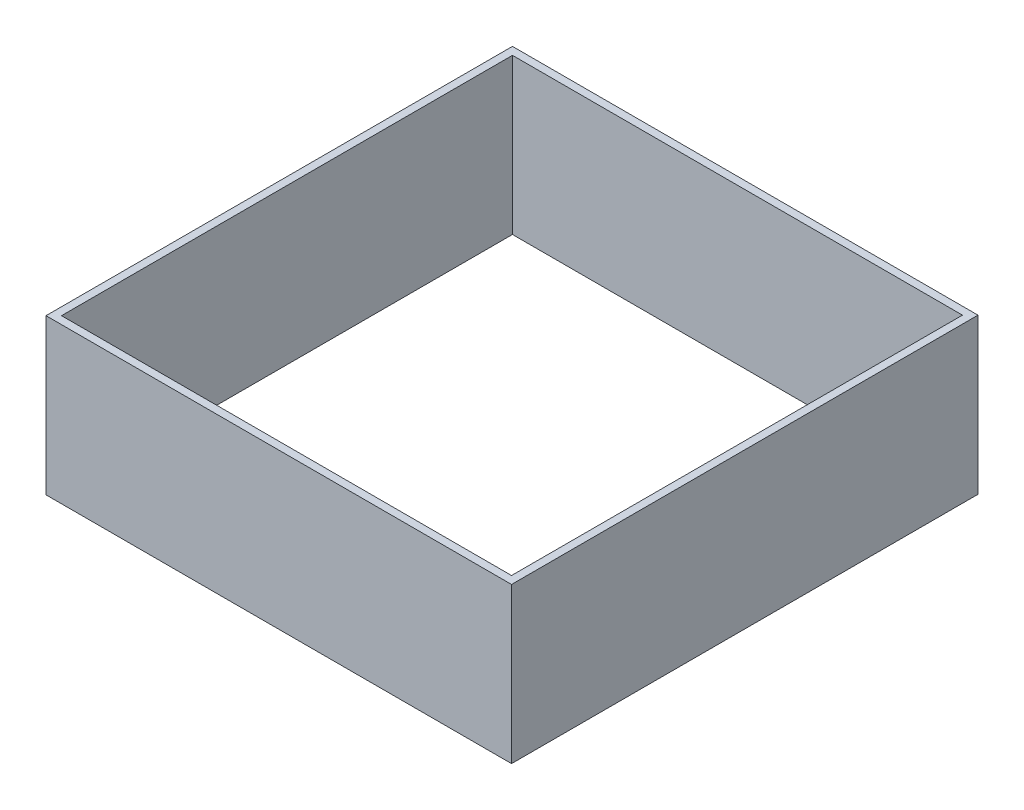
ISO-10303-21;
HEADER;
FILE_DESCRIPTION(('STEP AP214'),'2;1');
FILE_NAME('part.step','',(''),(''),'','','');
FILE_SCHEMA(('AUTOMOTIVE_DESIGN { 1 0 10303 214 1 1 1 1 }'));
ENDSEC;
DATA;
#1=APPLICATION_CONTEXT('core data for automotive mechanical design processes');
#2=APPLICATION_PROTOCOL_DEFINITION('international standard','automotive_design',2000,#1);
#3=PRODUCT_CONTEXT('',#1,'mechanical');
#4=PRODUCT('Part','Part','',(#3));
#5=PRODUCT_RELATED_PRODUCT_CATEGORY('part','',(#4));
#6=PRODUCT_DEFINITION_FORMATION('','',#4);
#7=PRODUCT_DEFINITION_CONTEXT('part definition',#1,'design');
#8=PRODUCT_DEFINITION('design','',#6,#7);
#9=PRODUCT_DEFINITION_SHAPE('','',#8);
#10=(LENGTH_UNIT() NAMED_UNIT(*) SI_UNIT(.MILLI.,.METRE.));
#11=(NAMED_UNIT(*) PLANE_ANGLE_UNIT() SI_UNIT($,.RADIAN.));
#12=(NAMED_UNIT(*) SI_UNIT($,.STERADIAN.) SOLID_ANGLE_UNIT());
#13=UNCERTAINTY_MEASURE_WITH_UNIT(LENGTH_MEASURE(1.E-05),#10,'distance_accuracy_value','');
#14=(GEOMETRIC_REPRESENTATION_CONTEXT(3) GLOBAL_UNCERTAINTY_ASSIGNED_CONTEXT((#13)) GLOBAL_UNIT_ASSIGNED_CONTEXT((#10,
#11,#12)) REPRESENTATION_CONTEXT('',''));
#15=CARTESIAN_POINT('',(0.,0.,0.));
#16=DIRECTION('',(0.,0.,1.));
#17=DIRECTION('',(1.,0.,0.));
#18=AXIS2_PLACEMENT_3D('',#15,#16,#17);
#19=CARTESIAN_POINT('',(145.,0.,0.));
#20=DIRECTION('',(1.,0.,0.));
#21=DIRECTION('',(0.,1.,0.));
#22=AXIS2_PLACEMENT_3D('',#19,#20,#21);
#23=PLANE('',#22);
#24=DIRECTION('',(0.,1.,0.));
#25=VECTOR('',#24,1.);
#26=CARTESIAN_POINT('',(145.,0.,-290.3));
#27=LINE('',#26,#25);
#28=CARTESIAN_POINT('',(145.,-50.,-290.3));
#29=VERTEX_POINT('',#28);
#30=CARTESIAN_POINT('',(145.,50.,-290.3));
#31=VERTEX_POINT('',#30);
#32=EDGE_CURVE('E56',#29,#31,#27,.T.);
#33=ORIENTED_EDGE('',*,*,#32,.F.);
#34=DIRECTION('',(0.,0.,-1.));
#35=VECTOR('',#34,1.);
#36=CARTESIAN_POINT('',(145.,-50.,5.3));
#37=LINE('',#36,#35);
#38=CARTESIAN_POINT('',(145.,-50.,0.3));
#39=VERTEX_POINT('',#38);
#40=EDGE_CURVE('E217',#39,#29,#37,.T.);
#41=ORIENTED_EDGE('',*,*,#40,.F.);
#42=DIRECTION('',(0.,1.,0.));
#43=VECTOR('',#42,1.);
#44=CARTESIAN_POINT('',(145.,0.,0.3));
#45=LINE('',#44,#43);
#46=CARTESIAN_POINT('',(145.,50.,0.3));
#47=VERTEX_POINT('',#46);
#48=EDGE_CURVE('E220',#39,#47,#45,.T.);
#49=ORIENTED_EDGE('',*,*,#48,.T.);
#50=DIRECTION('',(0.,0.,-1.));
#51=VECTOR('',#50,1.);
#52=CARTESIAN_POINT('',(145.,50.,5.3));
#53=LINE('',#52,#51);
#54=EDGE_CURVE('E52',#47,#31,#53,.T.);
#55=ORIENTED_EDGE('',*,*,#54,.T.);
#56=EDGE_LOOP('',(#33,#41,#49,#55));
#57=FACE_BOUND('',#56,.T.);
#58=ADVANCED_FACE('F37',(#57),#23,.F.);
#59=CARTESIAN_POINT('',(-145.,0.,0.));
#60=DIRECTION('',(-1.,0.,0.));
#61=DIRECTION('',(0.,1.,0.));
#62=AXIS2_PLACEMENT_3D('',#59,#60,#61);
#63=PLANE('',#62);
#64=DIRECTION('',(0.,-1.,0.));
#65=VECTOR('',#64,1.);
#66=CARTESIAN_POINT('',(-145.,0.,-290.3));
#67=LINE('',#66,#65);
#68=CARTESIAN_POINT('',(-145.,50.,-290.3));
#69=VERTEX_POINT('',#68);
#70=CARTESIAN_POINT('',(-145.,-50.,-290.3));
#71=VERTEX_POINT('',#70);
#72=EDGE_CURVE('E11',#69,#71,#67,.T.);
#73=ORIENTED_EDGE('',*,*,#72,.F.);
#74=DIRECTION('',(0.,0.,-1.));
#75=VECTOR('',#74,1.);
#76=CARTESIAN_POINT('',(-145.,50.,5.3));
#77=LINE('',#76,#75);
#78=CARTESIAN_POINT('',(-145.,50.,0.3));
#79=VERTEX_POINT('',#78);
#80=EDGE_CURVE('E209',#79,#69,#77,.T.);
#81=ORIENTED_EDGE('',*,*,#80,.F.);
#82=DIRECTION('',(0.,-1.,0.));
#83=VECTOR('',#82,1.);
#84=CARTESIAN_POINT('',(-145.,0.,0.3));
#85=LINE('',#84,#83);
#86=CARTESIAN_POINT('',(-145.,-50.,0.3));
#87=VERTEX_POINT('',#86);
#88=EDGE_CURVE('E215',#79,#87,#85,.T.);
#89=ORIENTED_EDGE('',*,*,#88,.T.);
#90=DIRECTION('',(0.,0.,-1.));
#91=VECTOR('',#90,1.);
#92=CARTESIAN_POINT('',(-145.,-50.,5.3));
#93=LINE('',#92,#91);
#94=EDGE_CURVE('E212',#87,#71,#93,.T.);
#95=ORIENTED_EDGE('',*,*,#94,.T.);
#96=EDGE_LOOP('',(#73,#81,#89,#95));
#97=FACE_BOUND('',#96,.T.);
#98=ADVANCED_FACE('F402',(#97),#63,.F.);
#99=CARTESIAN_POINT('',(0.,0.,0.3));
#100=DIRECTION('',(0.,0.,1.));
#101=DIRECTION('',(1.,0.,0.));
#102=AXIS2_PLACEMENT_3D('',#99,#100,#101);
#103=PLANE('',#102);
#104=DIRECTION('',(1.,0.,0.));
#105=VECTOR('',#104,1.);
#106=CARTESIAN_POINT('',(-20.,20.,0.3));
#107=LINE('',#106,#105);
#108=CARTESIAN_POINT('',(-20.,20.,0.3));
#109=VERTEX_POINT('',#108);
#110=CARTESIAN_POINT('',(20.,20.,0.3));
#111=VERTEX_POINT('',#110);
#112=EDGE_CURVE('E315',#109,#111,#107,.T.);
#113=ORIENTED_EDGE('',*,*,#112,.F.);
#114=DIRECTION('',(0.,-1.,0.));
#115=VECTOR('',#114,1.);
#116=CARTESIAN_POINT('',(-20.,20.,0.3));
#117=LINE('',#116,#115);
#118=CARTESIAN_POINT('',(-20.,-20.,0.3));
#119=VERTEX_POINT('',#118);
#120=EDGE_CURVE('E307',#109,#119,#117,.T.);
#121=ORIENTED_EDGE('',*,*,#120,.T.);
#122=DIRECTION('',(1.,0.,0.));
#123=VECTOR('',#122,1.);
#124=CARTESIAN_POINT('',(-20.,-20.,0.3));
#125=LINE('',#124,#123);
#126=CARTESIAN_POINT('',(20.,-20.,0.3));
#127=VERTEX_POINT('',#126);
#128=EDGE_CURVE('E309',#119,#127,#125,.T.);
#129=ORIENTED_EDGE('',*,*,#128,.T.);
#130=DIRECTION('',(0.,-1.,0.));
#131=VECTOR('',#130,1.);
#132=CARTESIAN_POINT('',(20.,20.,0.3));
#133=LINE('',#132,#131);
#134=EDGE_CURVE('E312',#111,#127,#133,.T.);
#135=ORIENTED_EDGE('',*,*,#134,.F.);
#136=EDGE_LOOP('',(#113,#121,#129,#135));
#137=FACE_BOUND('',#136,.T.);
#138=ORIENTED_EDGE('',*,*,#88,.F.);
#139=DIRECTION('',(-1.,0.,0.));
#140=VECTOR('',#139,1.);
#141=CARTESIAN_POINT('',(-150.,50.,0.3));
#142=LINE('',#141,#140);
#143=EDGE_CURVE('E222',#47,#79,#142,.T.);
#144=ORIENTED_EDGE('',*,*,#143,.F.);
#145=ORIENTED_EDGE('',*,*,#48,.F.);
#146=DIRECTION('',(1.,0.,0.));
#147=VECTOR('',#146,1.);
#148=CARTESIAN_POINT('',(-150.,-50.,0.3));
#149=LINE('',#148,#147);
#150=EDGE_CURVE('E225',#87,#39,#149,.T.);
#151=ORIENTED_EDGE('',*,*,#150,.F.);
#152=EDGE_LOOP('',(#138,#144,#145,#151));
#153=FACE_BOUND('',#152,.T.);
#154=ADVANCED_FACE('F394',(#137,#153),#103,.F.);
#155=CARTESIAN_POINT('',(0.,-10.,-10.));
#156=DIRECTION('',(0.,1.,0.));
#157=DIRECTION('',(0.,0.,1.));
#158=AXIS2_PLACEMENT_3D('',#155,#156,#157);
#159=CYLINDRICAL_SURFACE('',#158,5.);
#160=DIRECTION('',(0.,1.,0.));
#161=VECTOR('',#160,1.);
#162=CARTESIAN_POINT('',(-5.,-10.,-10.));
#163=LINE('',#162,#161);
#164=CARTESIAN_POINT('',(-5.,-10.,-10.));
#165=VERTEX_POINT('',#164);
#166=CARTESIAN_POINT('',(-5.,-2.5,-10.));
#167=VERTEX_POINT('',#166);
#168=EDGE_CURVE('E304',#165,#167,#163,.T.);
#169=ORIENTED_EDGE('',*,*,#168,.T.);
#170=CARTESIAN_POINT('',(0.,-2.5,-10.));
#171=DIRECTION('',(0.,1.,0.));
#172=DIRECTION('',(0.,0.,1.));
#173=AXIS2_PLACEMENT_3D('',#170,#171,#172);
#174=CIRCLE('',#173,5.);
#175=CARTESIAN_POINT('',(5.,-2.5,-10.));
#176=VERTEX_POINT('',#175);
#177=EDGE_CURVE('E248',#167,#176,#174,.F.);
#178=ORIENTED_EDGE('',*,*,#177,.T.);
#179=DIRECTION('',(0.,1.,0.));
#180=VECTOR('',#179,1.);
#181=CARTESIAN_POINT('',(5.,-10.,-10.));
#182=LINE('',#181,#180);
#183=CARTESIAN_POINT('',(5.,-10.,-10.));
#184=VERTEX_POINT('',#183);
#185=EDGE_CURVE('E293',#184,#176,#182,.T.);
#186=ORIENTED_EDGE('',*,*,#185,.F.);
#187=CARTESIAN_POINT('',(0.,-10.,-10.));
#188=DIRECTION('',(0.,1.,0.));
#189=DIRECTION('',(0.,0.,1.));
#190=AXIS2_PLACEMENT_3D('',#187,#188,#189);
#191=CIRCLE('',#190,5.);
#192=EDGE_CURVE('E280',#184,#165,#191,.T.);
#193=ORIENTED_EDGE('',*,*,#192,.T.);
#194=EDGE_LOOP('',(#169,#178,#186,#193));
#195=FACE_BOUND('',#194,.T.);
#196=ADVANCED_FACE('F375',(#195),#159,.T.);
#197=CARTESIAN_POINT('',(0.,-10.,-10.));
#198=DIRECTION('',(0.,1.,0.));
#199=DIRECTION('',(0.,0.,1.));
#200=AXIS2_PLACEMENT_3D('',#197,#198,#199);
#201=CYLINDRICAL_SURFACE('',#200,2.5);
#202=CARTESIAN_POINT('',(0.,-10.,-10.));
#203=DIRECTION('',(0.,1.,0.));
#204=DIRECTION('',(0.,0.,1.));
#205=AXIS2_PLACEMENT_3D('',#202,#203,#204);
#206=CIRCLE('',#205,2.5);
#207=CARTESIAN_POINT('',(0.,-10.,-7.5));
#208=VERTEX_POINT('',#207);
#209=EDGE_CURVE('E277',#208,#208,#206,.T.);
#210=ORIENTED_EDGE('',*,*,#209,.F.);
#211=EDGE_LOOP('',(#210));
#212=FACE_BOUND('',#211,.T.);
#213=CARTESIAN_POINT('',(0.,-2.5,-10.));
#214=DIRECTION('',(0.,1.,0.));
#215=DIRECTION('',(0.,0.,1.));
#216=AXIS2_PLACEMENT_3D('',#213,#214,#215);
#217=CIRCLE('',#216,2.5);
#218=CARTESIAN_POINT('',(0.,-2.5,-7.5));
#219=VERTEX_POINT('',#218);
#220=EDGE_CURVE('E244',#219,#219,#217,.F.);
#221=ORIENTED_EDGE('',*,*,#220,.F.);
#222=EDGE_LOOP('',(#221));
#223=FACE_BOUND('',#222,.T.);
#224=ADVANCED_FACE('F383',(#212,#223),#201,.F.);
#225=CARTESIAN_POINT('',(0.,0.,0.));
#226=DIRECTION('',(0.,0.,1.));
#227=DIRECTION('',(1.,0.,0.));
#228=AXIS2_PLACEMENT_3D('',#225,#226,#227);
#229=PLANE('',#228);
#230=DIRECTION('',(0.,-1.,0.));
#231=VECTOR('',#230,1.);
#232=CARTESIAN_POINT('',(-20.,20.,0.));
#233=LINE('',#232,#231);
#234=CARTESIAN_POINT('',(-20.,20.,0.));
#235=VERTEX_POINT('',#234);
#236=CARTESIAN_POINT('',(-20.,-20.,0.));
#237=VERTEX_POINT('',#236);
#238=EDGE_CURVE('E296',#235,#237,#233,.T.);
#239=ORIENTED_EDGE('',*,*,#238,.F.);
#240=DIRECTION('',(1.,0.,0.));
#241=VECTOR('',#240,1.);
#242=CARTESIAN_POINT('',(-20.,20.,0.));
#243=LINE('',#242,#241);
#244=CARTESIAN_POINT('',(20.,20.,0.));
#245=VERTEX_POINT('',#244);
#246=EDGE_CURVE('E310',#235,#245,#243,.T.);
#247=ORIENTED_EDGE('',*,*,#246,.T.);
#248=DIRECTION('',(0.,-1.,0.));
#249=VECTOR('',#248,1.);
#250=CARTESIAN_POINT('',(20.,20.,0.));
#251=LINE('',#250,#249);
#252=CARTESIAN_POINT('',(20.,-20.,0.));
#253=VERTEX_POINT('',#252);
#254=EDGE_CURVE('E324',#245,#253,#251,.T.);
#255=ORIENTED_EDGE('',*,*,#254,.T.);
#256=DIRECTION('',(1.,0.,0.));
#257=VECTOR('',#256,1.);
#258=CARTESIAN_POINT('',(-20.,-20.,0.));
#259=LINE('',#258,#257);
#260=EDGE_CURVE('E321',#237,#253,#259,.T.);
#261=ORIENTED_EDGE('',*,*,#260,.F.);
#262=EDGE_LOOP('',(#239,#247,#255,#261));
#263=FACE_BOUND('',#262,.T.);
#264=DIRECTION('',(1.,0.,0.));
#265=VECTOR('',#264,1.);
#266=CARTESIAN_POINT('',(-5.,-10.,0.));
#267=LINE('',#266,#265);
#268=CARTESIAN_POINT('',(-5.,-10.,0.));
#269=VERTEX_POINT('',#268);
#270=CARTESIAN_POINT('',(5.,-10.,0.));
#271=VERTEX_POINT('',#270);
#272=EDGE_CURVE('E286',#269,#271,#267,.T.);
#273=ORIENTED_EDGE('',*,*,#272,.T.);
#274=DIRECTION('',(0.,1.,0.));
#275=VECTOR('',#274,1.);
#276=CARTESIAN_POINT('',(5.,-10.,0.));
#277=LINE('',#276,#275);
#278=CARTESIAN_POINT('',(5.,10.,0.));
#279=VERTEX_POINT('',#278);
#280=EDGE_CURVE('E298',#271,#279,#277,.T.);
#281=ORIENTED_EDGE('',*,*,#280,.T.);
#282=DIRECTION('',(1.,0.,0.));
#283=VECTOR('',#282,1.);
#284=CARTESIAN_POINT('',(-5.,10.,0.));
#285=LINE('',#284,#283);
#286=CARTESIAN_POINT('',(-5.,10.,0.));
#287=VERTEX_POINT('',#286);
#288=EDGE_CURVE('E272',#287,#279,#285,.T.);
#289=ORIENTED_EDGE('',*,*,#288,.F.);
#290=DIRECTION('',(0.,1.,0.));
#291=VECTOR('',#290,1.);
#292=CARTESIAN_POINT('',(-5.,-10.,0.));
#293=LINE('',#292,#291);
#294=EDGE_CURVE('E301',#269,#287,#293,.T.);
#295=ORIENTED_EDGE('',*,*,#294,.F.);
#296=EDGE_LOOP('',(#273,#281,#289,#295));
#297=FACE_BOUND('',#296,.T.);
#298=ADVANCED_FACE('F368',(#263,#297),#229,.F.);
#299=CARTESIAN_POINT('',(-20.,20.,0.3));
#300=DIRECTION('',(1.,0.,0.));
#301=DIRECTION('',(0.,1.,0.));
#302=AXIS2_PLACEMENT_3D('',#299,#300,#301);
#303=PLANE('',#302);
#304=ORIENTED_EDGE('',*,*,#238,.T.);
#305=DIRECTION('',(0.,0.,-1.));
#306=VECTOR('',#305,1.);
#307=CARTESIAN_POINT('',(-20.,-20.,0.3));
#308=LINE('',#307,#306);
#309=EDGE_CURVE('E334',#119,#237,#308,.T.);
#310=ORIENTED_EDGE('',*,*,#309,.F.);
#311=ORIENTED_EDGE('',*,*,#120,.F.);
#312=DIRECTION('',(0.,0.,-1.));
#313=VECTOR('',#312,1.);
#314=CARTESIAN_POINT('',(-20.,20.,0.3));
#315=LINE('',#314,#313);
#316=EDGE_CURVE('E318',#109,#235,#315,.T.);
#317=ORIENTED_EDGE('',*,*,#316,.T.);
#318=EDGE_LOOP('',(#304,#310,#311,#317));
#319=FACE_BOUND('',#318,.T.);
#320=ADVANCED_FACE('F39',(#319),#303,.F.);
#321=CARTESIAN_POINT('',(-20.,-20.,0.3));
#322=DIRECTION('',(0.,1.,0.));
#323=DIRECTION('',(0.,0.,1.));
#324=AXIS2_PLACEMENT_3D('',#321,#322,#323);
#325=PLANE('',#324);
#326=ORIENTED_EDGE('',*,*,#260,.T.);
#327=DIRECTION('',(0.,0.,-1.));
#328=VECTOR('',#327,1.);
#329=CARTESIAN_POINT('',(20.,-20.,0.3));
#330=LINE('',#329,#328);
#331=EDGE_CURVE('E332',#127,#253,#330,.T.);
#332=ORIENTED_EDGE('',*,*,#331,.F.);
#333=ORIENTED_EDGE('',*,*,#128,.F.);
#334=ORIENTED_EDGE('',*,*,#309,.T.);
#335=EDGE_LOOP('',(#326,#332,#333,#334));
#336=FACE_BOUND('',#335,.T.);
#337=ADVANCED_FACE('F464',(#336),#325,.F.);
#338=CARTESIAN_POINT('',(20.,20.,0.3));
#339=DIRECTION('',(1.,0.,0.));
#340=DIRECTION('',(0.,1.,0.));
#341=AXIS2_PLACEMENT_3D('',#338,#339,#340);
#342=PLANE('',#341);
#343=ORIENTED_EDGE('',*,*,#254,.F.);
#344=DIRECTION('',(0.,0.,-1.));
#345=VECTOR('',#344,1.);
#346=CARTESIAN_POINT('',(20.,20.,0.3));
#347=LINE('',#346,#345);
#348=EDGE_CURVE('E330',#111,#245,#347,.T.);
#349=ORIENTED_EDGE('',*,*,#348,.F.);
#350=ORIENTED_EDGE('',*,*,#134,.T.);
#351=ORIENTED_EDGE('',*,*,#331,.T.);
#352=EDGE_LOOP('',(#343,#349,#350,#351));
#353=FACE_BOUND('',#352,.T.);
#354=ADVANCED_FACE('F471',(#353),#342,.T.);
#355=CARTESIAN_POINT('',(-20.,20.,0.3));
#356=DIRECTION('',(0.,1.,0.));
#357=DIRECTION('',(0.,0.,1.));
#358=AXIS2_PLACEMENT_3D('',#355,#356,#357);
#359=PLANE('',#358);
#360=ORIENTED_EDGE('',*,*,#246,.F.);
#361=ORIENTED_EDGE('',*,*,#316,.F.);
#362=ORIENTED_EDGE('',*,*,#112,.T.);
#363=ORIENTED_EDGE('',*,*,#348,.T.);
#364=EDGE_LOOP('',(#360,#361,#362,#363));
#365=FACE_BOUND('',#364,.T.);
#366=ADVANCED_FACE('F478',(#365),#359,.T.);
#367=CARTESIAN_POINT('',(0.,2.5,-10.));
#368=DIRECTION('',(0.,1.,0.));
#369=DIRECTION('',(0.,0.,1.));
#370=AXIS2_PLACEMENT_3D('',#367,#368,#369);
#371=CIRCLE('',#370,5.);
#372=CARTESIAN_POINT('',(-5.,2.5,-10.));
#373=VERTEX_POINT('',#372);
#374=CARTESIAN_POINT('',(5.,2.5,-10.));
#375=VERTEX_POINT('',#374);
#376=EDGE_CURVE('E257',#373,#375,#371,.F.);
#377=ORIENTED_EDGE('',*,*,#376,.F.);
#378=CARTESIAN_POINT('',(-5.,10.,-10.));
#379=VERTEX_POINT('',#378);
#380=EDGE_CURVE('E292',#373,#379,#163,.T.);
#381=ORIENTED_EDGE('',*,*,#380,.T.);
#382=CARTESIAN_POINT('',(0.,10.,-10.));
#383=DIRECTION('',(0.,1.,0.));
#384=DIRECTION('',(0.,0.,1.));
#385=AXIS2_PLACEMENT_3D('',#382,#383,#384);
#386=CIRCLE('',#385,5.);
#387=CARTESIAN_POINT('',(5.,10.,-10.));
#388=VERTEX_POINT('',#387);
#389=EDGE_CURVE('E267',#388,#379,#386,.T.);
#390=ORIENTED_EDGE('',*,*,#389,.F.);
#391=EDGE_CURVE('E297',#375,#388,#182,.T.);
#392=ORIENTED_EDGE('',*,*,#391,.F.);
#393=EDGE_LOOP('',(#377,#381,#390,#392));
#394=FACE_BOUND('',#393,.T.);
#395=ADVANCED_FACE('F360',(#394),#159,.T.);
#396=CARTESIAN_POINT('',(5.,-10.,-10.));
#397=DIRECTION('',(1.,0.,0.));
#398=DIRECTION('',(0.,0.,-1.));
#399=AXIS2_PLACEMENT_3D('',#396,#397,#398);
#400=PLANE('',#399);
#401=DIRECTION('',(0.,0.,1.));
#402=VECTOR('',#401,1.);
#403=CARTESIAN_POINT('',(5.,2.5,-10.));
#404=LINE('',#403,#402);
#405=CARTESIAN_POINT('',(5.,2.5,-4.));
#406=VERTEX_POINT('',#405);
#407=EDGE_CURVE('E259',#375,#406,#404,.T.);
#408=ORIENTED_EDGE('',*,*,#407,.F.);
#409=ORIENTED_EDGE('',*,*,#391,.T.);
#410=DIRECTION('',(0.,0.,-1.));
#411=VECTOR('',#410,1.);
#412=CARTESIAN_POINT('',(5.,10.,-10.));
#413=LINE('',#412,#411);
#414=EDGE_CURVE('E274',#279,#388,#413,.T.);
#415=ORIENTED_EDGE('',*,*,#414,.F.);
#416=ORIENTED_EDGE('',*,*,#280,.F.);
#417=DIRECTION('',(0.,0.,-1.));
#418=VECTOR('',#417,1.);
#419=CARTESIAN_POINT('',(5.,-10.,-10.));
#420=LINE('',#419,#418);
#421=EDGE_CURVE('E289',#271,#184,#420,.T.);
#422=ORIENTED_EDGE('',*,*,#421,.T.);
#423=ORIENTED_EDGE('',*,*,#185,.T.);
#424=DIRECTION('',(0.,0.,1.));
#425=VECTOR('',#424,1.);
#426=CARTESIAN_POINT('',(5.,-2.5,-10.));
#427=LINE('',#426,#425);
#428=CARTESIAN_POINT('',(5.,-2.5,-4.));
#429=VERTEX_POINT('',#428);
#430=EDGE_CURVE('E251',#176,#429,#427,.T.);
#431=ORIENTED_EDGE('',*,*,#430,.T.);
#432=DIRECTION('',(0.,1.,0.));
#433=VECTOR('',#432,1.);
#434=CARTESIAN_POINT('',(5.,-10.,-4.));
#435=LINE('',#434,#433);
#436=EDGE_CURVE('E261',#429,#406,#435,.T.);
#437=ORIENTED_EDGE('',*,*,#436,.T.);
#438=EDGE_LOOP('',(#408,#409,#415,#416,#422,#423,#431,#437));
#439=FACE_BOUND('',#438,.T.);
#440=ADVANCED_FACE('F356',(#439),#400,.T.);
#441=CARTESIAN_POINT('',(-5.,-10.,-10.));
#442=DIRECTION('',(-1.,0.,0.));
#443=DIRECTION('',(0.,0.,1.));
#444=AXIS2_PLACEMENT_3D('',#441,#442,#443);
#445=PLANE('',#444);
#446=DIRECTION('',(0.,0.,-1.));
#447=VECTOR('',#446,1.);
#448=CARTESIAN_POINT('',(-5.,2.5,-10.));
#449=LINE('',#448,#447);
#450=CARTESIAN_POINT('',(-5.,2.5,-4.));
#451=VERTEX_POINT('',#450);
#452=EDGE_CURVE('E255',#451,#373,#449,.T.);
#453=ORIENTED_EDGE('',*,*,#452,.F.);
#454=DIRECTION('',(0.,-1.,0.));
#455=VECTOR('',#454,1.);
#456=CARTESIAN_POINT('',(-5.,-10.,-4.));
#457=LINE('',#456,#455);
#458=CARTESIAN_POINT('',(-5.,-2.5,-4.));
#459=VERTEX_POINT('',#458);
#460=EDGE_CURVE('E45',#451,#459,#457,.T.);
#461=ORIENTED_EDGE('',*,*,#460,.T.);
#462=DIRECTION('',(0.,0.,-1.));
#463=VECTOR('',#462,1.);
#464=CARTESIAN_POINT('',(-5.,-2.5,-10.));
#465=LINE('',#464,#463);
#466=EDGE_CURVE('E245',#459,#167,#465,.T.);
#467=ORIENTED_EDGE('',*,*,#466,.T.);
#468=ORIENTED_EDGE('',*,*,#168,.F.);
#469=DIRECTION('',(0.,0.,1.));
#470=VECTOR('',#469,1.);
#471=CARTESIAN_POINT('',(-5.,-10.,-10.));
#472=LINE('',#471,#470);
#473=EDGE_CURVE('E283',#165,#269,#472,.T.);
#474=ORIENTED_EDGE('',*,*,#473,.T.);
#475=ORIENTED_EDGE('',*,*,#294,.T.);
#476=DIRECTION('',(0.,0.,1.));
#477=VECTOR('',#476,1.);
#478=CARTESIAN_POINT('',(-5.,10.,-10.));
#479=LINE('',#478,#477);
#480=EDGE_CURVE('E270',#379,#287,#479,.T.);
#481=ORIENTED_EDGE('',*,*,#480,.F.);
#482=ORIENTED_EDGE('',*,*,#380,.F.);
#483=EDGE_LOOP('',(#453,#461,#467,#468,#474,#475,#481,#482));
#484=FACE_BOUND('',#483,.T.);
#485=ADVANCED_FACE('F343',(#484),#445,.T.);
#486=CARTESIAN_POINT('',(0.,-10.,-10.));
#487=DIRECTION('',(0.,1.,0.));
#488=DIRECTION('',(0.,0.,1.));
#489=AXIS2_PLACEMENT_3D('',#486,#487,#488);
#490=PLANE('',#489);
#491=ORIENTED_EDGE('',*,*,#209,.T.);
#492=EDGE_LOOP('',(#491));
#493=FACE_BOUND('',#492,.T.);
#494=ORIENTED_EDGE('',*,*,#192,.F.);
#495=ORIENTED_EDGE('',*,*,#421,.F.);
#496=ORIENTED_EDGE('',*,*,#272,.F.);
#497=ORIENTED_EDGE('',*,*,#473,.F.);
#498=EDGE_LOOP('',(#494,#495,#496,#497));
#499=FACE_BOUND('',#498,.T.);
#500=ADVANCED_FACE('F373',(#493,#499),#490,.F.);
#501=CARTESIAN_POINT('',(0.,2.5,-10.));
#502=DIRECTION('',(0.,1.,0.));
#503=DIRECTION('',(0.,0.,1.));
#504=AXIS2_PLACEMENT_3D('',#501,#502,#503);
#505=CIRCLE('',#504,2.5);
#506=CARTESIAN_POINT('',(0.,2.5,-7.5));
#507=VERTEX_POINT('',#506);
#508=EDGE_CURVE('E254',#507,#507,#505,.F.);
#509=ORIENTED_EDGE('',*,*,#508,.T.);
#510=EDGE_LOOP('',(#509));
#511=FACE_BOUND('',#510,.T.);
#512=CARTESIAN_POINT('',(0.,10.,-10.));
#513=DIRECTION('',(0.,1.,0.));
#514=DIRECTION('',(0.,0.,1.));
#515=AXIS2_PLACEMENT_3D('',#512,#513,#514);
#516=CIRCLE('',#515,2.5);
#517=CARTESIAN_POINT('',(0.,10.,-7.5));
#518=VERTEX_POINT('',#517);
#519=EDGE_CURVE('E264',#518,#518,#516,.T.);
#520=ORIENTED_EDGE('',*,*,#519,.T.);
#521=EDGE_LOOP('',(#520));
#522=FACE_BOUND('',#521,.T.);
#523=ADVANCED_FACE('F387',(#511,#522),#201,.F.);
#524=CARTESIAN_POINT('',(0.,10.,-10.));
#525=DIRECTION('',(0.,1.,0.));
#526=DIRECTION('',(0.,0.,1.));
#527=AXIS2_PLACEMENT_3D('',#524,#525,#526);
#528=PLANE('',#527);
#529=ORIENTED_EDGE('',*,*,#389,.T.);
#530=ORIENTED_EDGE('',*,*,#480,.T.);
#531=ORIENTED_EDGE('',*,*,#288,.T.);
#532=ORIENTED_EDGE('',*,*,#414,.T.);
#533=EDGE_LOOP('',(#529,#530,#531,#532));
#534=FACE_BOUND('',#533,.T.);
#535=ORIENTED_EDGE('',*,*,#519,.F.);
#536=EDGE_LOOP('',(#535));
#537=FACE_BOUND('',#536,.T.);
#538=ADVANCED_FACE('F363',(#534,#537),#528,.T.);
#539=CARTESIAN_POINT('',(0.,2.5,0.));
#540=DIRECTION('',(0.,1.,0.));
#541=DIRECTION('',(0.,0.,1.));
#542=AXIS2_PLACEMENT_3D('',#539,#540,#541);
#543=PLANE('',#542);
#544=ORIENTED_EDGE('',*,*,#407,.T.);
#545=DIRECTION('',(1.,0.,0.));
#546=VECTOR('',#545,1.);
#547=CARTESIAN_POINT('',(-7.02807757222276,2.5,-4.));
#548=LINE('',#547,#546);
#549=EDGE_CURVE('E241',#451,#406,#548,.T.);
#550=ORIENTED_EDGE('',*,*,#549,.F.);
#551=ORIENTED_EDGE('',*,*,#452,.T.);
#552=ORIENTED_EDGE('',*,*,#376,.T.);
#553=EDGE_LOOP('',(#544,#550,#551,#552));
#554=FACE_BOUND('',#553,.T.);
#555=ORIENTED_EDGE('',*,*,#508,.F.);
#556=EDGE_LOOP('',(#555));
#557=FACE_BOUND('',#556,.T.);
#558=ADVANCED_FACE('F350',(#554,#557),#543,.F.);
#559=CARTESIAN_POINT('',(0.,-2.5,0.));
#560=DIRECTION('',(0.,1.,0.));
#561=DIRECTION('',(0.,0.,1.));
#562=AXIS2_PLACEMENT_3D('',#559,#560,#561);
#563=PLANE('',#562);
#564=ORIENTED_EDGE('',*,*,#177,.F.);
#565=ORIENTED_EDGE('',*,*,#466,.F.);
#566=DIRECTION('',(1.,0.,0.));
#567=VECTOR('',#566,1.);
#568=CARTESIAN_POINT('',(-7.02807757222276,-2.5,-4.));
#569=LINE('',#568,#567);
#570=EDGE_CURVE('E238',#459,#429,#569,.T.);
#571=ORIENTED_EDGE('',*,*,#570,.T.);
#572=ORIENTED_EDGE('',*,*,#430,.F.);
#573=EDGE_LOOP('',(#564,#565,#571,#572));
#574=FACE_BOUND('',#573,.T.);
#575=ORIENTED_EDGE('',*,*,#220,.T.);
#576=EDGE_LOOP('',(#575));
#577=FACE_BOUND('',#576,.T.);
#578=ADVANCED_FACE('F377',(#574,#577),#563,.T.);
#579=CARTESIAN_POINT('',(-7.02807757222276,2.5,-4.));
#580=DIRECTION('',(0.,0.,-1.));
#581=DIRECTION('',(-1.,0.,0.));
#582=AXIS2_PLACEMENT_3D('',#579,#580,#581);
#583=PLANE('',#582);
#584=ORIENTED_EDGE('',*,*,#570,.F.);
#585=ORIENTED_EDGE('',*,*,#460,.F.);
#586=ORIENTED_EDGE('',*,*,#549,.T.);
#587=ORIENTED_EDGE('',*,*,#436,.F.);
#588=EDGE_LOOP('',(#584,#585,#586,#587));
#589=FACE_BOUND('',#588,.T.);
#590=ADVANCED_FACE('F348',(#589),#583,.T.);
#591=CARTESIAN_POINT('',(150.,50.,5.3));
#592=DIRECTION('',(-1.,0.,0.));
#593=DIRECTION('',(0.,-1.,0.));
#594=AXIS2_PLACEMENT_3D('',#591,#592,#593);
#595=PLANE('',#594);
#596=DIRECTION('',(0.,1.,0.));
#597=VECTOR('',#596,1.);
#598=CARTESIAN_POINT('',(150.,50.,-295.3));
#599=LINE('',#598,#597);
#600=CARTESIAN_POINT('',(150.,-50.,-295.3));
#601=VERTEX_POINT('',#600);
#602=CARTESIAN_POINT('',(150.,50.,-295.3));
#603=VERTEX_POINT('',#602);
#604=EDGE_CURVE('E177',#601,#603,#599,.T.);
#605=ORIENTED_EDGE('',*,*,#604,.T.);
#606=DIRECTION('',(0.,0.,-1.));
#607=VECTOR('',#606,1.);
#608=CARTESIAN_POINT('',(150.,50.,5.3));
#609=LINE('',#608,#607);
#610=CARTESIAN_POINT('',(150.,50.,5.3));
#611=VERTEX_POINT('',#610);
#612=EDGE_CURVE('E236',#611,#603,#609,.T.);
#613=ORIENTED_EDGE('',*,*,#612,.F.);
#614=DIRECTION('',(0.,1.,0.));
#615=VECTOR('',#614,1.);
#616=CARTESIAN_POINT('',(150.,50.,5.3));
#617=LINE('',#616,#615);
#618=CARTESIAN_POINT('',(150.,-50.,5.3));
#619=VERTEX_POINT('',#618);
#620=EDGE_CURVE('E180',#619,#611,#617,.T.);
#621=ORIENTED_EDGE('',*,*,#620,.F.);
#622=DIRECTION('',(0.,0.,-1.));
#623=VECTOR('',#622,1.);
#624=CARTESIAN_POINT('',(150.,-50.,5.3));
#625=LINE('',#624,#623);
#626=EDGE_CURVE('E173',#619,#601,#625,.T.);
#627=ORIENTED_EDGE('',*,*,#626,.T.);
#628=EDGE_LOOP('',(#605,#613,#621,#627));
#629=FACE_BOUND('',#628,.T.);
#630=ADVANCED_FACE('F175',(#629),#595,.F.);
#631=CARTESIAN_POINT('',(-150.,50.,5.3));
#632=DIRECTION('',(0.,-1.,0.));
#633=DIRECTION('',(0.,0.,-1.));
#634=AXIS2_PLACEMENT_3D('',#631,#632,#633);
#635=PLANE('',#634);
#636=ORIENTED_EDGE('',*,*,#80,.T.);
#637=DIRECTION('',(-1.,0.,0.));
#638=VECTOR('',#637,1.);
#639=CARTESIAN_POINT('',(-150.,50.,-290.3));
#640=LINE('',#639,#638);
#641=EDGE_CURVE('E195',#31,#69,#640,.T.);
#642=ORIENTED_EDGE('',*,*,#641,.F.);
#643=ORIENTED_EDGE('',*,*,#54,.F.);
#644=ORIENTED_EDGE('',*,*,#143,.T.);
#645=EDGE_LOOP('',(#636,#642,#643,#644));
#646=FACE_BOUND('',#645,.T.);
#647=DIRECTION('',(-1.,0.,0.));
#648=VECTOR('',#647,1.);
#649=CARTESIAN_POINT('',(-150.,50.,-295.3));
#650=LINE('',#649,#648);
#651=CARTESIAN_POINT('',(-150.,50.,-295.3));
#652=VERTEX_POINT('',#651);
#653=EDGE_CURVE('E194',#603,#652,#650,.T.);
#654=ORIENTED_EDGE('',*,*,#653,.T.);
#655=DIRECTION('',(0.,0.,-1.));
#656=VECTOR('',#655,1.);
#657=CARTESIAN_POINT('',(-150.,50.,5.3));
#658=LINE('',#657,#656);
#659=CARTESIAN_POINT('',(-150.,50.,5.3));
#660=VERTEX_POINT('',#659);
#661=EDGE_CURVE('E234',#660,#652,#658,.T.);
#662=ORIENTED_EDGE('',*,*,#661,.F.);
#663=DIRECTION('',(-1.,0.,0.));
#664=VECTOR('',#663,1.);
#665=CARTESIAN_POINT('',(-150.,50.,5.3));
#666=LINE('',#665,#664);
#667=EDGE_CURVE('E224',#611,#660,#666,.T.);
#668=ORIENTED_EDGE('',*,*,#667,.F.);
#669=ORIENTED_EDGE('',*,*,#612,.T.);
#670=EDGE_LOOP('',(#654,#662,#668,#669));
#671=FACE_BOUND('',#670,.T.);
#672=ADVANCED_FACE('F426',(#646,#671),#635,.F.);
#673=CARTESIAN_POINT('',(-150.,50.,5.3));
#674=DIRECTION('',(1.,0.,0.));
#675=DIRECTION('',(0.,0.,-1.));
#676=AXIS2_PLACEMENT_3D('',#673,#674,#675);
#677=PLANE('',#676);
#678=DIRECTION('',(0.,-1.,0.));
#679=VECTOR('',#678,1.);
#680=CARTESIAN_POINT('',(-150.,50.,-295.3));
#681=LINE('',#680,#679);
#682=CARTESIAN_POINT('',(-150.,-50.,-295.3));
#683=VERTEX_POINT('',#682);
#684=EDGE_CURVE('E199',#652,#683,#681,.T.);
#685=ORIENTED_EDGE('',*,*,#684,.T.);
#686=DIRECTION('',(0.,0.,-1.));
#687=VECTOR('',#686,1.);
#688=CARTESIAN_POINT('',(-150.,-50.,5.3));
#689=LINE('',#688,#687);
#690=CARTESIAN_POINT('',(-150.,-50.,5.3));
#691=VERTEX_POINT('',#690);
#692=EDGE_CURVE('E184',#691,#683,#689,.T.);
#693=ORIENTED_EDGE('',*,*,#692,.F.);
#694=DIRECTION('',(0.,-1.,0.));
#695=VECTOR('',#694,1.);
#696=CARTESIAN_POINT('',(-150.,50.,5.3));
#697=LINE('',#696,#695);
#698=EDGE_CURVE('E227',#660,#691,#697,.T.);
#699=ORIENTED_EDGE('',*,*,#698,.F.);
#700=ORIENTED_EDGE('',*,*,#661,.T.);
#701=EDGE_LOOP('',(#685,#693,#699,#700));
#702=FACE_BOUND('',#701,.T.);
#703=ADVANCED_FACE('F422',(#702),#677,.F.);
#704=CARTESIAN_POINT('',(-150.,-50.,5.3));
#705=DIRECTION('',(0.,1.,0.));
#706=DIRECTION('',(0.,0.,1.));
#707=AXIS2_PLACEMENT_3D('',#704,#705,#706);
#708=PLANE('',#707);
#709=ORIENTED_EDGE('',*,*,#40,.T.);
#710=DIRECTION('',(1.,0.,0.));
#711=VECTOR('',#710,1.);
#712=CARTESIAN_POINT('',(-150.,-50.,-290.3));
#713=LINE('',#712,#711);
#714=EDGE_CURVE('E204',#71,#29,#713,.T.);
#715=ORIENTED_EDGE('',*,*,#714,.F.);
#716=ORIENTED_EDGE('',*,*,#94,.F.);
#717=ORIENTED_EDGE('',*,*,#150,.T.);
#718=EDGE_LOOP('',(#709,#715,#716,#717));
#719=FACE_BOUND('',#718,.T.);
#720=DIRECTION('',(1.,0.,0.));
#721=VECTOR('',#720,1.);
#722=CARTESIAN_POINT('',(-150.,-50.,-295.3));
#723=LINE('',#722,#721);
#724=EDGE_CURVE('E191',#683,#601,#723,.T.);
#725=ORIENTED_EDGE('',*,*,#724,.T.);
#726=ORIENTED_EDGE('',*,*,#626,.F.);
#727=DIRECTION('',(1.,0.,0.));
#728=VECTOR('',#727,1.);
#729=CARTESIAN_POINT('',(-150.,-50.,5.3));
#730=LINE('',#729,#728);
#731=EDGE_CURVE('E185',#691,#619,#730,.T.);
#732=ORIENTED_EDGE('',*,*,#731,.F.);
#733=ORIENTED_EDGE('',*,*,#692,.T.);
#734=EDGE_LOOP('',(#725,#726,#732,#733));
#735=FACE_BOUND('',#734,.T.);
#736=ADVANCED_FACE('F197',(#719,#735),#708,.F.);
#737=CARTESIAN_POINT('',(0.,0.,5.3));
#738=DIRECTION('',(0.,0.,1.));
#739=DIRECTION('',(1.,0.,0.));
#740=AXIS2_PLACEMENT_3D('',#737,#738,#739);
#741=PLANE('',#740);
#742=ORIENTED_EDGE('',*,*,#731,.T.);
#743=ORIENTED_EDGE('',*,*,#620,.T.);
#744=ORIENTED_EDGE('',*,*,#667,.T.);
#745=ORIENTED_EDGE('',*,*,#698,.T.);
#746=EDGE_LOOP('',(#742,#743,#744,#745));
#747=FACE_BOUND('',#746,.T.);
#748=ADVANCED_FACE('F412',(#747),#741,.T.);
#749=CARTESIAN_POINT('',(0.,0.,-290.3));
#750=DIRECTION('',(0.,0.,-1.));
#751=DIRECTION('',(1.,0.,0.));
#752=AXIS2_PLACEMENT_3D('',#749,#750,#751);
#753=PLANE('',#752);
#754=ORIENTED_EDGE('',*,*,#714,.T.);
#755=ORIENTED_EDGE('',*,*,#32,.T.);
#756=ORIENTED_EDGE('',*,*,#641,.T.);
#757=ORIENTED_EDGE('',*,*,#72,.T.);
#758=EDGE_LOOP('',(#754,#755,#756,#757));
#759=FACE_BOUND('',#758,.T.);
#760=ADVANCED_FACE('F415',(#759),#753,.F.);
#761=CARTESIAN_POINT('',(0.,0.,-295.3));
#762=DIRECTION('',(0.,0.,-1.));
#763=DIRECTION('',(1.,0.,0.));
#764=AXIS2_PLACEMENT_3D('',#761,#762,#763);
#765=PLANE('',#764);
#766=ORIENTED_EDGE('',*,*,#604,.F.);
#767=ORIENTED_EDGE('',*,*,#724,.F.);
#768=ORIENTED_EDGE('',*,*,#684,.F.);
#769=ORIENTED_EDGE('',*,*,#653,.F.);
#770=EDGE_LOOP('',(#766,#767,#768,#769));
#771=FACE_BOUND('',#770,.T.);
#772=ADVANCED_FACE('F189',(#771),#765,.T.);
#773=CLOSED_SHELL('',(#58,#98,#154,#196,#224,#298,#320,#337,#354,#366,#395,#440,#485,#500,#523,
#538,#558,#578,#590,#630,#672,#703,#736,#748,#760,#772));
#774=MANIFOLD_SOLID_BREP('B2',#773);
#775=ADVANCED_BREP_SHAPE_REPRESENTATION('',(#18,#774),#14);
#776=SHAPE_DEFINITION_REPRESENTATION(#9,#775);
ENDSEC;
END-ISO-10303-21;
